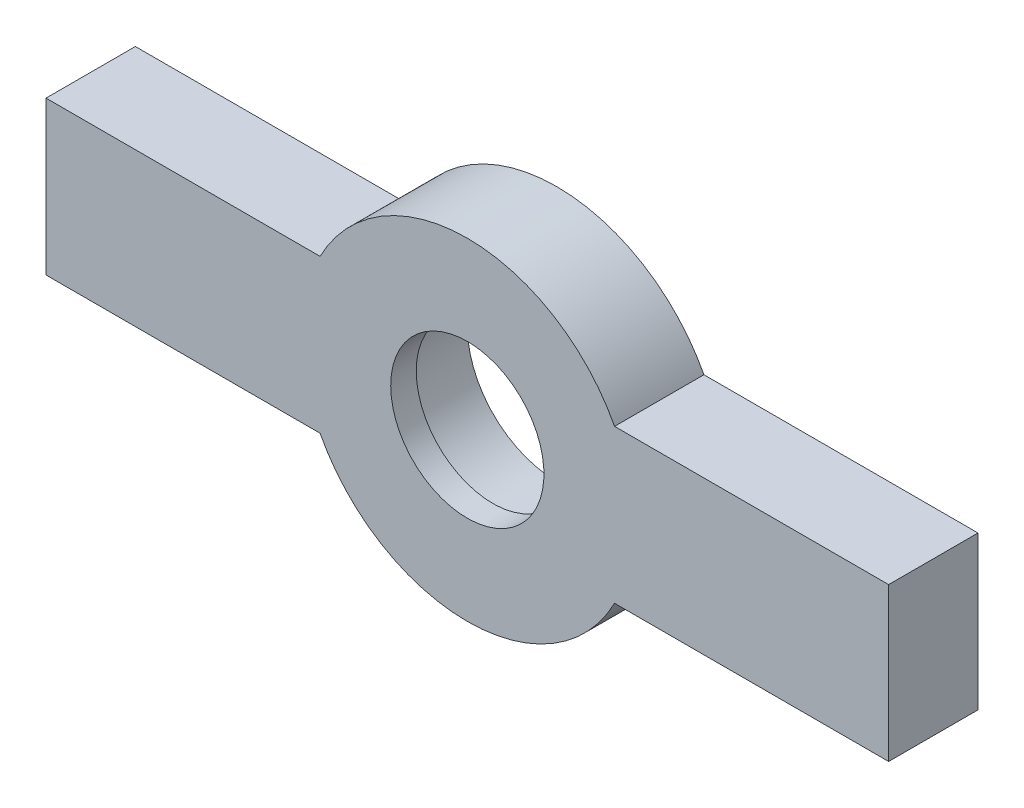
ISO-10303-21;
HEADER;
FILE_DESCRIPTION(('STEP AP214'),'2;1');
FILE_NAME('part.step','',(''),(''),'','','');
FILE_SCHEMA(('AUTOMOTIVE_DESIGN { 1 0 10303 214 1 1 1 1 }'));
ENDSEC;
DATA;
#1=APPLICATION_CONTEXT('core data for automotive mechanical design processes');
#2=APPLICATION_PROTOCOL_DEFINITION('international standard','automotive_design',2000,#1);
#3=PRODUCT_CONTEXT('',#1,'mechanical');
#4=PRODUCT('Part','Part','',(#3));
#5=PRODUCT_RELATED_PRODUCT_CATEGORY('part','',(#4));
#6=PRODUCT_DEFINITION_FORMATION('','',#4);
#7=PRODUCT_DEFINITION_CONTEXT('part definition',#1,'design');
#8=PRODUCT_DEFINITION('design','',#6,#7);
#9=PRODUCT_DEFINITION_SHAPE('','',#8);
#10=(LENGTH_UNIT() NAMED_UNIT(*) SI_UNIT(.MILLI.,.METRE.));
#11=(NAMED_UNIT(*) PLANE_ANGLE_UNIT() SI_UNIT($,.RADIAN.));
#12=(NAMED_UNIT(*) SI_UNIT($,.STERADIAN.) SOLID_ANGLE_UNIT());
#13=UNCERTAINTY_MEASURE_WITH_UNIT(LENGTH_MEASURE(1.E-05),#10,'distance_accuracy_value','');
#14=(GEOMETRIC_REPRESENTATION_CONTEXT(3) GLOBAL_UNCERTAINTY_ASSIGNED_CONTEXT((#13)) GLOBAL_UNIT_ASSIGNED_CONTEXT((#10,
#11,#12)) REPRESENTATION_CONTEXT('',''));
#15=CARTESIAN_POINT('',(0.,0.,0.));
#16=DIRECTION('',(0.,0.,1.));
#17=DIRECTION('',(1.,0.,0.));
#18=AXIS2_PLACEMENT_3D('',#15,#16,#17);
#19=CARTESIAN_POINT('',(-35.,-210.,-35.));
#20=DIRECTION('',(1.,0.,0.));
#21=DIRECTION('',(0.,0.,-1.));
#22=AXIS2_PLACEMENT_3D('',#19,#20,#21);
#23=PLANE('',#22);
#24=DIRECTION('',(0.,1.,0.));
#25=VECTOR('',#24,1.);
#26=CARTESIAN_POINT('',(-35.,-210.,0.));
#27=LINE('',#26,#25);
#28=CARTESIAN_POINT('',(-35.,-270.,0.));
#29=VERTEX_POINT('',#28);
#30=CARTESIAN_POINT('',(-35.,-210.,0.));
#31=VERTEX_POINT('',#30);
#32=EDGE_CURVE('E142',#29,#31,#27,.T.);
#33=ORIENTED_EDGE('',*,*,#32,.F.);
#34=DIRECTION('',(0.,0.,1.));
#35=VECTOR('',#34,1.);
#36=CARTESIAN_POINT('',(-35.,-270.,-35.));
#37=LINE('',#36,#35);
#38=CARTESIAN_POINT('',(-35.,-270.,-35.));
#39=VERTEX_POINT('',#38);
#40=EDGE_CURVE('E13',#39,#29,#37,.T.);
#41=ORIENTED_EDGE('',*,*,#40,.F.);
#42=DIRECTION('',(0.,1.,0.));
#43=VECTOR('',#42,1.);
#44=CARTESIAN_POINT('',(-35.,-210.,-35.));
#45=LINE('',#44,#43);
#46=CARTESIAN_POINT('',(-35.,-210.,-35.));
#47=VERTEX_POINT('',#46);
#48=EDGE_CURVE('E163',#39,#47,#45,.T.);
#49=ORIENTED_EDGE('',*,*,#48,.T.);
#50=DIRECTION('',(0.,0.,1.));
#51=VECTOR('',#50,1.);
#52=CARTESIAN_POINT('',(-35.,-210.,-35.));
#53=LINE('',#52,#51);
#54=EDGE_CURVE('E48',#47,#31,#53,.T.);
#55=ORIENTED_EDGE('',*,*,#54,.T.);
#56=EDGE_LOOP('',(#33,#41,#49,#55));
#57=FACE_BOUND('',#56,.T.);
#58=ADVANCED_FACE('F45',(#57),#23,.T.);
#59=CARTESIAN_POINT('',(-35.,-270.,-35.));
#60=DIRECTION('',(0.,-1.,0.));
#61=DIRECTION('',(0.,0.,-1.));
#62=AXIS2_PLACEMENT_3D('',#59,#60,#61);
#63=PLANE('',#62);
#64=DIRECTION('',(1.,0.,0.));
#65=VECTOR('',#64,1.);
#66=CARTESIAN_POINT('',(-35.,-270.,0.));
#67=LINE('',#66,#65);
#68=CARTESIAN_POINT('',(-142.337187026646,-270.,0.));
#69=VERTEX_POINT('',#68);
#70=EDGE_CURVE('E161',#69,#29,#67,.T.);
#71=ORIENTED_EDGE('',*,*,#70,.F.);
#72=DIRECTION('',(0.,0.,1.));
#73=VECTOR('',#72,1.);
#74=CARTESIAN_POINT('',(-142.337187026646,-270.,-35.));
#75=LINE('',#74,#73);
#76=CARTESIAN_POINT('',(-142.337187026646,-270.,-35.));
#77=VERTEX_POINT('',#76);
#78=EDGE_CURVE('E54',#77,#69,#75,.T.);
#79=ORIENTED_EDGE('',*,*,#78,.F.);
#80=DIRECTION('',(1.,0.,0.));
#81=VECTOR('',#80,1.);
#82=CARTESIAN_POINT('',(-35.,-270.,-35.));
#83=LINE('',#82,#81);
#84=EDGE_CURVE('E132',#77,#39,#83,.T.);
#85=ORIENTED_EDGE('',*,*,#84,.T.);
#86=ORIENTED_EDGE('',*,*,#40,.T.);
#87=EDGE_LOOP('',(#71,#79,#85,#86));
#88=FACE_BOUND('',#87,.T.);
#89=ADVANCED_FACE('F175',(#88),#63,.T.);
#90=CARTESIAN_POINT('',(-200.,-240.,-35.));
#91=DIRECTION('',(0.,0.,1.));
#92=DIRECTION('',(1.,0.,0.));
#93=AXIS2_PLACEMENT_3D('',#90,#91,#92);
#94=CYLINDRICAL_SURFACE('',#93,65.);
#95=CARTESIAN_POINT('',(-200.,-240.,0.));
#96=DIRECTION('',(0.,0.,1.));
#97=DIRECTION('',(1.,0.,0.));
#98=AXIS2_PLACEMENT_3D('',#95,#96,#97);
#99=CIRCLE('',#98,65.);
#100=CARTESIAN_POINT('',(-257.662812973354,-270.,0.));
#101=VERTEX_POINT('',#100);
#102=EDGE_CURVE('E119',#101,#69,#99,.T.);
#103=ORIENTED_EDGE('',*,*,#102,.F.);
#104=DIRECTION('',(0.,0.,1.));
#105=VECTOR('',#104,1.);
#106=CARTESIAN_POINT('',(-257.662812973354,-270.,-35.));
#107=LINE('',#106,#105);
#108=CARTESIAN_POINT('',(-257.662812973354,-270.,-35.));
#109=VERTEX_POINT('',#108);
#110=EDGE_CURVE('E114',#109,#101,#107,.T.);
#111=ORIENTED_EDGE('',*,*,#110,.F.);
#112=CARTESIAN_POINT('',(-200.,-240.,-35.));
#113=DIRECTION('',(0.,0.,1.));
#114=DIRECTION('',(1.,0.,0.));
#115=AXIS2_PLACEMENT_3D('',#112,#113,#114);
#116=CIRCLE('',#115,65.);
#117=EDGE_CURVE('E117',#109,#77,#116,.T.);
#118=ORIENTED_EDGE('',*,*,#117,.T.);
#119=ORIENTED_EDGE('',*,*,#78,.T.);
#120=EDGE_LOOP('',(#103,#111,#118,#119));
#121=FACE_BOUND('',#120,.T.);
#122=ADVANCED_FACE('F116',(#121),#94,.T.);
#123=CARTESIAN_POINT('',(-257.662812973354,-270.,-35.));
#124=DIRECTION('',(0.,-1.,0.));
#125=DIRECTION('',(0.,0.,-1.));
#126=AXIS2_PLACEMENT_3D('',#123,#124,#125);
#127=PLANE('',#126);
#128=DIRECTION('',(1.,0.,0.));
#129=VECTOR('',#128,1.);
#130=CARTESIAN_POINT('',(-257.662812973354,-270.,0.));
#131=LINE('',#130,#129);
#132=CARTESIAN_POINT('',(-365.,-270.,0.));
#133=VERTEX_POINT('',#132);
#134=EDGE_CURVE('E158',#133,#101,#131,.T.);
#135=ORIENTED_EDGE('',*,*,#134,.F.);
#136=DIRECTION('',(0.,0.,1.));
#137=VECTOR('',#136,1.);
#138=CARTESIAN_POINT('',(-365.,-270.,-35.));
#139=LINE('',#138,#137);
#140=CARTESIAN_POINT('',(-365.,-270.,-35.));
#141=VERTEX_POINT('',#140);
#142=EDGE_CURVE('E124',#141,#133,#139,.T.);
#143=ORIENTED_EDGE('',*,*,#142,.F.);
#144=DIRECTION('',(1.,0.,0.));
#145=VECTOR('',#144,1.);
#146=CARTESIAN_POINT('',(-257.662812973354,-270.,-35.));
#147=LINE('',#146,#145);
#148=EDGE_CURVE('E130',#141,#109,#147,.T.);
#149=ORIENTED_EDGE('',*,*,#148,.T.);
#150=ORIENTED_EDGE('',*,*,#110,.T.);
#151=EDGE_LOOP('',(#135,#143,#149,#150));
#152=FACE_BOUND('',#151,.T.);
#153=ADVANCED_FACE('F134',(#152),#127,.T.);
#154=CARTESIAN_POINT('',(-365.,-210.,-35.));
#155=DIRECTION('',(-1.,0.,0.));
#156=DIRECTION('',(0.,-1.,0.));
#157=AXIS2_PLACEMENT_3D('',#154,#155,#156);
#158=PLANE('',#157);
#159=DIRECTION('',(0.,-1.,0.));
#160=VECTOR('',#159,1.);
#161=CARTESIAN_POINT('',(-365.,-210.,0.));
#162=LINE('',#161,#160);
#163=CARTESIAN_POINT('',(-365.,-210.,0.));
#164=VERTEX_POINT('',#163);
#165=EDGE_CURVE('E155',#164,#133,#162,.T.);
#166=ORIENTED_EDGE('',*,*,#165,.F.);
#167=DIRECTION('',(0.,0.,1.));
#168=VECTOR('',#167,1.);
#169=CARTESIAN_POINT('',(-365.,-210.,-35.));
#170=LINE('',#169,#168);
#171=CARTESIAN_POINT('',(-365.,-210.,-35.));
#172=VERTEX_POINT('',#171);
#173=EDGE_CURVE('E167',#172,#164,#170,.T.);
#174=ORIENTED_EDGE('',*,*,#173,.F.);
#175=DIRECTION('',(0.,-1.,0.));
#176=VECTOR('',#175,1.);
#177=CARTESIAN_POINT('',(-365.,-210.,-35.));
#178=LINE('',#177,#176);
#179=EDGE_CURVE('E135',#172,#141,#178,.T.);
#180=ORIENTED_EDGE('',*,*,#179,.T.);
#181=ORIENTED_EDGE('',*,*,#142,.T.);
#182=EDGE_LOOP('',(#166,#174,#180,#181));
#183=FACE_BOUND('',#182,.T.);
#184=ADVANCED_FACE('F188',(#183),#158,.T.);
#185=CARTESIAN_POINT('',(-257.662812973354,-210.,-35.));
#186=DIRECTION('',(0.,1.,0.));
#187=DIRECTION('',(-1.,0.,0.));
#188=AXIS2_PLACEMENT_3D('',#185,#186,#187);
#189=PLANE('',#188);
#190=DIRECTION('',(-1.,0.,0.));
#191=VECTOR('',#190,1.);
#192=CARTESIAN_POINT('',(-257.662812973354,-210.,0.));
#193=LINE('',#192,#191);
#194=CARTESIAN_POINT('',(-257.662812973354,-210.,0.));
#195=VERTEX_POINT('',#194);
#196=EDGE_CURVE('E152',#195,#164,#193,.T.);
#197=ORIENTED_EDGE('',*,*,#196,.F.);
#198=DIRECTION('',(0.,0.,1.));
#199=VECTOR('',#198,1.);
#200=CARTESIAN_POINT('',(-257.662812973354,-210.,-35.));
#201=LINE('',#200,#199);
#202=CARTESIAN_POINT('',(-257.662812973354,-210.,-35.));
#203=VERTEX_POINT('',#202);
#204=EDGE_CURVE('E169',#203,#195,#201,.T.);
#205=ORIENTED_EDGE('',*,*,#204,.F.);
#206=DIRECTION('',(-1.,0.,0.));
#207=VECTOR('',#206,1.);
#208=CARTESIAN_POINT('',(-257.662812973354,-210.,-35.));
#209=LINE('',#208,#207);
#210=EDGE_CURVE('E137',#203,#172,#209,.T.);
#211=ORIENTED_EDGE('',*,*,#210,.T.);
#212=ORIENTED_EDGE('',*,*,#173,.T.);
#213=EDGE_LOOP('',(#197,#205,#211,#212));
#214=FACE_BOUND('',#213,.T.);
#215=ADVANCED_FACE('F191',(#214),#189,.T.);
#216=CARTESIAN_POINT('',(-200.,-240.,-35.));
#217=DIRECTION('',(0.,0.,1.));
#218=DIRECTION('',(1.,0.,0.));
#219=AXIS2_PLACEMENT_3D('',#216,#217,#218);
#220=CYLINDRICAL_SURFACE('',#219,65.);
#221=CARTESIAN_POINT('',(-200.,-240.,0.));
#222=DIRECTION('',(0.,0.,1.));
#223=DIRECTION('',(1.,0.,0.));
#224=AXIS2_PLACEMENT_3D('',#221,#222,#223);
#225=CIRCLE('',#224,65.);
#226=CARTESIAN_POINT('',(-142.337187026646,-210.,0.));
#227=VERTEX_POINT('',#226);
#228=EDGE_CURVE('E149',#227,#195,#225,.T.);
#229=ORIENTED_EDGE('',*,*,#228,.F.);
#230=DIRECTION('',(0.,0.,1.));
#231=VECTOR('',#230,1.);
#232=CARTESIAN_POINT('',(-142.337187026646,-210.,-35.));
#233=LINE('',#232,#231);
#234=CARTESIAN_POINT('',(-142.337187026646,-210.,-35.));
#235=VERTEX_POINT('',#234);
#236=EDGE_CURVE('E170',#235,#227,#233,.T.);
#237=ORIENTED_EDGE('',*,*,#236,.F.);
#238=CARTESIAN_POINT('',(-200.,-240.,-35.));
#239=DIRECTION('',(0.,0.,1.));
#240=DIRECTION('',(1.,0.,0.));
#241=AXIS2_PLACEMENT_3D('',#238,#239,#240);
#242=CIRCLE('',#241,65.);
#243=EDGE_CURVE('E241',#235,#203,#242,.T.);
#244=ORIENTED_EDGE('',*,*,#243,.T.);
#245=ORIENTED_EDGE('',*,*,#204,.T.);
#246=EDGE_LOOP('',(#229,#237,#244,#245));
#247=FACE_BOUND('',#246,.T.);
#248=ADVANCED_FACE('F195',(#247),#220,.T.);
#249=CARTESIAN_POINT('',(-35.,-210.,-35.));
#250=DIRECTION('',(0.,1.,0.));
#251=DIRECTION('',(-1.,0.,0.));
#252=AXIS2_PLACEMENT_3D('',#249,#250,#251);
#253=PLANE('',#252);
#254=DIRECTION('',(-1.,0.,0.));
#255=VECTOR('',#254,1.);
#256=CARTESIAN_POINT('',(-35.,-210.,0.));
#257=LINE('',#256,#255);
#258=EDGE_CURVE('E145',#31,#227,#257,.T.);
#259=ORIENTED_EDGE('',*,*,#258,.F.);
#260=ORIENTED_EDGE('',*,*,#54,.F.);
#261=DIRECTION('',(-1.,0.,0.));
#262=VECTOR('',#261,1.);
#263=CARTESIAN_POINT('',(-35.,-210.,-35.));
#264=LINE('',#263,#262);
#265=EDGE_CURVE('E239',#47,#235,#264,.T.);
#266=ORIENTED_EDGE('',*,*,#265,.T.);
#267=ORIENTED_EDGE('',*,*,#236,.T.);
#268=EDGE_LOOP('',(#259,#260,#266,#267));
#269=FACE_BOUND('',#268,.T.);
#270=ADVANCED_FACE('F172',(#269),#253,.T.);
#271=CARTESIAN_POINT('',(-200.,-240.,-35.));
#272=DIRECTION('',(0.,0.,1.));
#273=DIRECTION('',(1.,0.,0.));
#274=AXIS2_PLACEMENT_3D('',#271,#272,#273);
#275=PLANE('',#274);
#276=CARTESIAN_POINT('',(-200.,-240.,-35.));
#277=DIRECTION('',(0.,0.,-1.));
#278=DIRECTION('',(-1.,0.,0.));
#279=AXIS2_PLACEMENT_3D('',#276,#277,#278);
#280=CIRCLE('',#279,35.);
#281=CARTESIAN_POINT('',(-235.,-240.,-35.));
#282=VERTEX_POINT('',#281);
#283=EDGE_CURVE('E231',#282,#282,#280,.T.);
#284=ORIENTED_EDGE('',*,*,#283,.F.);
#285=EDGE_LOOP('',(#284));
#286=FACE_BOUND('',#285,.T.);
#287=ORIENTED_EDGE('',*,*,#48,.F.);
#288=ORIENTED_EDGE('',*,*,#84,.F.);
#289=ORIENTED_EDGE('',*,*,#117,.F.);
#290=ORIENTED_EDGE('',*,*,#148,.F.);
#291=ORIENTED_EDGE('',*,*,#179,.F.);
#292=ORIENTED_EDGE('',*,*,#210,.F.);
#293=ORIENTED_EDGE('',*,*,#243,.F.);
#294=ORIENTED_EDGE('',*,*,#265,.F.);
#295=EDGE_LOOP('',(#287,#288,#289,#290,#291,#292,#293,#294));
#296=FACE_BOUND('',#295,.T.);
#297=ADVANCED_FACE('F128',(#286,#296),#275,.F.);
#298=CARTESIAN_POINT('',(-200.,-240.,0.));
#299=DIRECTION('',(0.,0.,1.));
#300=DIRECTION('',(1.,0.,0.));
#301=AXIS2_PLACEMENT_3D('',#298,#299,#300);
#302=PLANE('',#301);
#303=CARTESIAN_POINT('',(-200.,-240.,0.));
#304=DIRECTION('',(0.,0.,-1.));
#305=DIRECTION('',(-1.,0.,0.));
#306=AXIS2_PLACEMENT_3D('',#303,#304,#305);
#307=CIRCLE('',#306,30.);
#308=CARTESIAN_POINT('',(-230.,-240.,0.));
#309=VERTEX_POINT('',#308);
#310=EDGE_CURVE('E226',#309,#309,#307,.T.);
#311=ORIENTED_EDGE('',*,*,#310,.T.);
#312=EDGE_LOOP('',(#311));
#313=FACE_BOUND('',#312,.T.);
#314=ORIENTED_EDGE('',*,*,#32,.T.);
#315=ORIENTED_EDGE('',*,*,#258,.T.);
#316=ORIENTED_EDGE('',*,*,#228,.T.);
#317=ORIENTED_EDGE('',*,*,#196,.T.);
#318=ORIENTED_EDGE('',*,*,#165,.T.);
#319=ORIENTED_EDGE('',*,*,#134,.T.);
#320=ORIENTED_EDGE('',*,*,#102,.T.);
#321=ORIENTED_EDGE('',*,*,#70,.T.);
#322=EDGE_LOOP('',(#314,#315,#316,#317,#318,#319,#320,#321));
#323=FACE_BOUND('',#322,.T.);
#324=ADVANCED_FACE('F174',(#313,#323),#302,.T.);
#325=CARTESIAN_POINT('',(-200.,-240.,-10.));
#326=DIRECTION('',(0.,0.,-1.));
#327=DIRECTION('',(-1.,0.,0.));
#328=AXIS2_PLACEMENT_3D('',#325,#326,#327);
#329=CYLINDRICAL_SURFACE('',#328,35.);
#330=CARTESIAN_POINT('',(-200.,-240.,-10.));
#331=DIRECTION('',(0.,0.,-1.));
#332=DIRECTION('',(-1.,0.,0.));
#333=AXIS2_PLACEMENT_3D('',#330,#331,#332);
#334=CIRCLE('',#333,35.);
#335=CARTESIAN_POINT('',(-235.,-240.,-10.));
#336=VERTEX_POINT('',#335);
#337=EDGE_CURVE('E146',#336,#336,#334,.T.);
#338=ORIENTED_EDGE('',*,*,#337,.F.);
#339=EDGE_LOOP('',(#338));
#340=FACE_BOUND('',#339,.T.);
#341=ORIENTED_EDGE('',*,*,#283,.T.);
#342=EDGE_LOOP('',(#341));
#343=FACE_BOUND('',#342,.T.);
#344=ADVANCED_FACE('F207',(#340,#343),#329,.F.);
#345=CARTESIAN_POINT('',(-200.,-240.,-10.));
#346=DIRECTION('',(0.,0.,-1.));
#347=DIRECTION('',(-1.,0.,0.));
#348=AXIS2_PLACEMENT_3D('',#345,#346,#347);
#349=PLANE('',#348);
#350=CARTESIAN_POINT('',(-200.,-240.,-10.));
#351=DIRECTION('',(0.,0.,-1.));
#352=DIRECTION('',(-1.,0.,0.));
#353=AXIS2_PLACEMENT_3D('',#350,#351,#352);
#354=CIRCLE('',#353,30.);
#355=CARTESIAN_POINT('',(-230.,-240.,-10.));
#356=VERTEX_POINT('',#355);
#357=EDGE_CURVE('E229',#356,#356,#354,.T.);
#358=ORIENTED_EDGE('',*,*,#357,.F.);
#359=EDGE_LOOP('',(#358));
#360=FACE_BOUND('',#359,.T.);
#361=ORIENTED_EDGE('',*,*,#337,.T.);
#362=EDGE_LOOP('',(#361));
#363=FACE_BOUND('',#362,.T.);
#364=ADVANCED_FACE('F213',(#360,#363),#349,.T.);
#365=CARTESIAN_POINT('',(-200.,-240.,0.));
#366=DIRECTION('',(0.,0.,-1.));
#367=DIRECTION('',(-1.,0.,0.));
#368=AXIS2_PLACEMENT_3D('',#365,#366,#367);
#369=CYLINDRICAL_SURFACE('',#368,30.);
#370=ORIENTED_EDGE('',*,*,#310,.F.);
#371=EDGE_LOOP('',(#370));
#372=FACE_BOUND('',#371,.T.);
#373=ORIENTED_EDGE('',*,*,#357,.T.);
#374=EDGE_LOOP('',(#373));
#375=FACE_BOUND('',#374,.T.);
#376=ADVANCED_FACE('F217',(#372,#375),#369,.F.);
#377=CLOSED_SHELL('',(#58,#89,#122,#153,#184,#215,#248,#270,#297,#324,#344,#364,#376));
#378=MANIFOLD_SOLID_BREP('B2',#377);
#379=ADVANCED_BREP_SHAPE_REPRESENTATION('',(#18,#378),#14);
#380=SHAPE_DEFINITION_REPRESENTATION(#9,#379);
ENDSEC;
END-ISO-10303-21;
